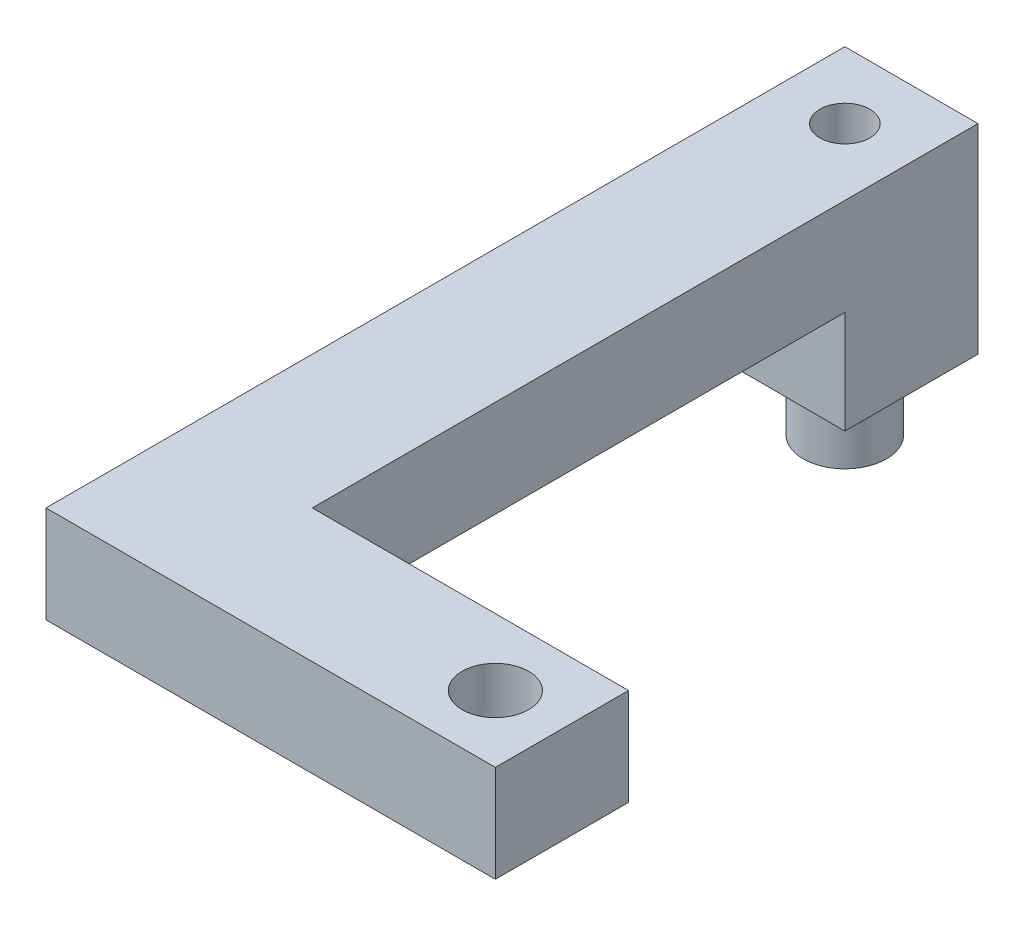
ISO-10303-21;
HEADER;
FILE_DESCRIPTION(('STEP AP214'),'2;1');
FILE_NAME('part.step','',(''),(''),'','','');
FILE_SCHEMA(('AUTOMOTIVE_DESIGN { 1 0 10303 214 1 1 1 1 }'));
ENDSEC;
DATA;
#1=APPLICATION_CONTEXT('core data for automotive mechanical design processes');
#2=APPLICATION_PROTOCOL_DEFINITION('international standard','automotive_design',2000,#1);
#3=PRODUCT_CONTEXT('',#1,'mechanical');
#4=PRODUCT('Part','Part','',(#3));
#5=PRODUCT_RELATED_PRODUCT_CATEGORY('part','',(#4));
#6=PRODUCT_DEFINITION_FORMATION('','',#4);
#7=PRODUCT_DEFINITION_CONTEXT('part definition',#1,'design');
#8=PRODUCT_DEFINITION('design','',#6,#7);
#9=PRODUCT_DEFINITION_SHAPE('','',#8);
#10=(LENGTH_UNIT() NAMED_UNIT(*) SI_UNIT(.MILLI.,.METRE.));
#11=(NAMED_UNIT(*) PLANE_ANGLE_UNIT() SI_UNIT($,.RADIAN.));
#12=(NAMED_UNIT(*) SI_UNIT($,.STERADIAN.) SOLID_ANGLE_UNIT());
#13=UNCERTAINTY_MEASURE_WITH_UNIT(LENGTH_MEASURE(1.E-05),#10,'distance_accuracy_value','');
#14=(GEOMETRIC_REPRESENTATION_CONTEXT(3) GLOBAL_UNCERTAINTY_ASSIGNED_CONTEXT((#13)) GLOBAL_UNIT_ASSIGNED_CONTEXT((#10,
#11,#12)) REPRESENTATION_CONTEXT('',''));
#15=CARTESIAN_POINT('',(0.,0.,0.));
#16=DIRECTION('',(0.,0.,1.));
#17=DIRECTION('',(1.,0.,0.));
#18=AXIS2_PLACEMENT_3D('',#15,#16,#17);
#19=CARTESIAN_POINT('',(-6.17970660146699,12.,-4.71271393643032));
#20=DIRECTION('',(1.,0.,0.));
#21=DIRECTION('',(0.,0.,-1.));
#22=AXIS2_PLACEMENT_3D('',#19,#20,#21);
#23=PLANE('',#22);
#24=DIRECTION('',(0.,0.,-1.));
#25=VECTOR('',#24,1.);
#26=CARTESIAN_POINT('',(-6.17970660146699,6.175,43.2872860635697));
#27=LINE('',#26,#25);
#28=CARTESIAN_POINT('',(-6.17970660146699,6.175,43.2872860635697));
#29=VERTEX_POINT('',#28);
#30=CARTESIAN_POINT('',(-6.179706601467,6.175,3.28728606356969));
#31=VERTEX_POINT('',#30);
#32=EDGE_CURVE('E159',#29,#31,#27,.T.);
#33=ORIENTED_EDGE('',*,*,#32,.F.);
#34=DIRECTION('',(0.,-1.,0.));
#35=VECTOR('',#34,1.);
#36=CARTESIAN_POINT('',(-6.17970660146699,12.,43.2872860635697));
#37=LINE('',#36,#35);
#38=CARTESIAN_POINT('',(-6.17970660146699,12.,43.2872860635697));
#39=VERTEX_POINT('',#38);
#40=EDGE_CURVE('E138',#39,#29,#37,.T.);
#41=ORIENTED_EDGE('',*,*,#40,.F.);
#42=DIRECTION('',(0.,0.,1.));
#43=VECTOR('',#42,1.);
#44=CARTESIAN_POINT('',(-6.17970660146699,12.,-4.71271393643032));
#45=LINE('',#44,#43);
#46=CARTESIAN_POINT('',(-6.17970660146699,12.,-4.71271393643032));
#47=VERTEX_POINT('',#46);
#48=EDGE_CURVE('E122',#47,#39,#45,.T.);
#49=ORIENTED_EDGE('',*,*,#48,.F.);
#50=DIRECTION('',(0.,-1.,0.));
#51=VECTOR('',#50,1.);
#52=CARTESIAN_POINT('',(-6.17970660146699,12.,-4.71271393643032));
#53=LINE('',#52,#51);
#54=CARTESIAN_POINT('',(-6.17970660146699,0.,-4.71271393643032));
#55=VERTEX_POINT('',#54);
#56=EDGE_CURVE('E128',#47,#55,#53,.T.);
#57=ORIENTED_EDGE('',*,*,#56,.T.);
#58=DIRECTION('',(0.,0.,1.));
#59=VECTOR('',#58,1.);
#60=CARTESIAN_POINT('',(-6.17970660146699,0.,-4.71271393643032));
#61=LINE('',#60,#59);
#62=CARTESIAN_POINT('',(-6.179706601467,0.,3.28728606356969));
#63=VERTEX_POINT('',#62);
#64=EDGE_CURVE('E129',#55,#63,#61,.T.);
#65=ORIENTED_EDGE('',*,*,#64,.T.);
#66=DIRECTION('',(0.,-1.,0.));
#67=VECTOR('',#66,1.);
#68=CARTESIAN_POINT('',(-6.179706601467,6.175,3.28728606356969));
#69=LINE('',#68,#67);
#70=EDGE_CURVE('E202',#31,#63,#69,.T.);
#71=ORIENTED_EDGE('',*,*,#70,.F.);
#72=EDGE_LOOP('',(#33,#41,#49,#57,#65,#71));
#73=FACE_BOUND('',#72,.T.);
#74=ADVANCED_FACE('F37',(#73),#23,.F.);
#75=CARTESIAN_POINT('',(-6.17970660146699,12.,43.2872860635697));
#76=DIRECTION('',(0.,0.,-1.));
#77=DIRECTION('',(-1.,0.,0.));
#78=AXIS2_PLACEMENT_3D('',#75,#76,#77);
#79=PLANE('',#78);
#80=DIRECTION('',(1.,0.,0.));
#81=VECTOR('',#80,1.);
#82=CARTESIAN_POINT('',(-6.17970660146699,6.175,43.2872860635697));
#83=LINE('',#82,#81);
#84=CARTESIAN_POINT('',(20.820293398533,6.175,43.2872860635697));
#85=VERTEX_POINT('',#84);
#86=EDGE_CURVE('E144',#29,#85,#83,.T.);
#87=ORIENTED_EDGE('',*,*,#86,.T.);
#88=DIRECTION('',(0.,-1.,0.));
#89=VECTOR('',#88,1.);
#90=CARTESIAN_POINT('',(20.820293398533,12.,43.2872860635697));
#91=LINE('',#90,#89);
#92=CARTESIAN_POINT('',(20.820293398533,12.,43.2872860635697));
#93=VERTEX_POINT('',#92);
#94=EDGE_CURVE('E135',#93,#85,#91,.T.);
#95=ORIENTED_EDGE('',*,*,#94,.F.);
#96=DIRECTION('',(1.,0.,0.));
#97=VECTOR('',#96,1.);
#98=CARTESIAN_POINT('',(-6.17970660146699,12.,43.2872860635697));
#99=LINE('',#98,#97);
#100=EDGE_CURVE('E124',#39,#93,#99,.T.);
#101=ORIENTED_EDGE('',*,*,#100,.F.);
#102=ORIENTED_EDGE('',*,*,#40,.T.);
#103=EDGE_LOOP('',(#87,#95,#101,#102));
#104=FACE_BOUND('',#103,.T.);
#105=ADVANCED_FACE('F192',(#104),#79,.F.);
#106=CARTESIAN_POINT('',(20.820293398533,12.,-4.71271393643032));
#107=DIRECTION('',(-1.,0.,0.));
#108=DIRECTION('',(0.,0.,1.));
#109=AXIS2_PLACEMENT_3D('',#106,#107,#108);
#110=PLANE('',#109);
#111=DIRECTION('',(0.,0.,-1.));
#112=VECTOR('',#111,1.);
#113=CARTESIAN_POINT('',(20.820293398533,6.175,43.2872860635697));
#114=LINE('',#113,#112);
#115=CARTESIAN_POINT('',(20.820293398533,6.175,35.2872860635697));
#116=VERTEX_POINT('',#115);
#117=EDGE_CURVE('E218',#85,#116,#114,.T.);
#118=ORIENTED_EDGE('',*,*,#117,.T.);
#119=DIRECTION('',(0.,1.,0.));
#120=VECTOR('',#119,1.);
#121=CARTESIAN_POINT('',(20.820293398533,0.,35.2872860635697));
#122=LINE('',#121,#120);
#123=CARTESIAN_POINT('',(20.820293398533,12.,35.2872860635697));
#124=VERTEX_POINT('',#123);
#125=EDGE_CURVE('E106',#116,#124,#122,.T.);
#126=ORIENTED_EDGE('',*,*,#125,.T.);
#127=DIRECTION('',(0.,0.,-1.));
#128=VECTOR('',#127,1.);
#129=CARTESIAN_POINT('',(20.820293398533,12.,-4.71271393643032));
#130=LINE('',#129,#128);
#131=EDGE_CURVE('E114',#93,#124,#130,.T.);
#132=ORIENTED_EDGE('',*,*,#131,.F.);
#133=ORIENTED_EDGE('',*,*,#94,.T.);
#134=EDGE_LOOP('',(#118,#126,#132,#133));
#135=FACE_BOUND('',#134,.T.);
#136=ADVANCED_FACE('F197',(#135),#110,.F.);
#137=CARTESIAN_POINT('',(0.,0.,0.));
#138=DIRECTION('',(0.,1.,0.));
#139=DIRECTION('',(0.,0.,1.));
#140=AXIS2_PLACEMENT_3D('',#137,#138,#139);
#141=PLANE('',#140);
#142=CARTESIAN_POINT('',(-2.17970660146699,0.,-0.712713936430315));
#143=DIRECTION('',(0.,1.,0.));
#144=DIRECTION('',(0.,0.,1.));
#145=AXIS2_PLACEMENT_3D('',#142,#143,#144);
#146=CIRCLE('',#145,2.5);
#147=CARTESIAN_POINT('',(-2.17970660146699,0.,1.78728606356968));
#148=VERTEX_POINT('',#147);
#149=EDGE_CURVE('E12',#148,#148,#146,.F.);
#150=ORIENTED_EDGE('',*,*,#149,.F.);
#151=EDGE_LOOP('',(#150));
#152=FACE_BOUND('',#151,.T.);
#153=DIRECTION('',(1.,0.,0.));
#154=VECTOR('',#153,1.);
#155=CARTESIAN_POINT('',(-6.179706601467,0.,3.28728606356969));
#156=LINE('',#155,#154);
#157=CARTESIAN_POINT('',(1.82029339853301,0.,3.28728606356968));
#158=VERTEX_POINT('',#157);
#159=EDGE_CURVE('E51',#63,#158,#156,.T.);
#160=ORIENTED_EDGE('',*,*,#159,.F.);
#161=ORIENTED_EDGE('',*,*,#64,.F.);
#162=DIRECTION('',(-1.,0.,0.));
#163=VECTOR('',#162,1.);
#164=CARTESIAN_POINT('',(-6.17970660146699,0.,-4.71271393643032));
#165=LINE('',#164,#163);
#166=CARTESIAN_POINT('',(1.82029339853301,0.,-4.71271393643031));
#167=VERTEX_POINT('',#166);
#168=EDGE_CURVE('E72',#167,#55,#165,.T.);
#169=ORIENTED_EDGE('',*,*,#168,.F.);
#170=DIRECTION('',(0.,0.,1.));
#171=VECTOR('',#170,1.);
#172=CARTESIAN_POINT('',(1.82029339853301,0.,-4.71271393643031));
#173=LINE('',#172,#171);
#174=EDGE_CURVE('E81',#167,#158,#173,.T.);
#175=ORIENTED_EDGE('',*,*,#174,.T.);
#176=EDGE_LOOP('',(#160,#161,#169,#175));
#177=FACE_BOUND('',#176,.T.);
#178=ADVANCED_FACE('F211',(#152,#177),#141,.F.);
#179=CARTESIAN_POINT('',(20.820293398533,0.,35.2872860635697));
#180=DIRECTION('',(0.,0.,1.));
#181=DIRECTION('',(1.,0.,0.));
#182=AXIS2_PLACEMENT_3D('',#179,#180,#181);
#183=PLANE('',#182);
#184=DIRECTION('',(1.,0.,0.));
#185=VECTOR('',#184,1.);
#186=CARTESIAN_POINT('',(20.820293398533,6.175,35.2872860635697));
#187=LINE('',#186,#185);
#188=CARTESIAN_POINT('',(1.82029339853301,6.175,35.2872860635697));
#189=VERTEX_POINT('',#188);
#190=EDGE_CURVE('E104',#189,#116,#187,.T.);
#191=ORIENTED_EDGE('',*,*,#190,.F.);
#192=DIRECTION('',(0.,1.,0.));
#193=VECTOR('',#192,1.);
#194=CARTESIAN_POINT('',(1.82029339853301,0.,35.2872860635697));
#195=LINE('',#194,#193);
#196=CARTESIAN_POINT('',(1.82029339853301,12.,35.2872860635697));
#197=VERTEX_POINT('',#196);
#198=EDGE_CURVE('E96',#189,#197,#195,.T.);
#199=ORIENTED_EDGE('',*,*,#198,.T.);
#200=DIRECTION('',(1.,0.,0.));
#201=VECTOR('',#200,1.);
#202=CARTESIAN_POINT('',(20.820293398533,12.,35.2872860635697));
#203=LINE('',#202,#201);
#204=EDGE_CURVE('E101',#197,#124,#203,.T.);
#205=ORIENTED_EDGE('',*,*,#204,.T.);
#206=ORIENTED_EDGE('',*,*,#125,.F.);
#207=EDGE_LOOP('',(#191,#199,#205,#206));
#208=FACE_BOUND('',#207,.T.);
#209=ADVANCED_FACE('F98',(#208),#183,.F.);
#210=CARTESIAN_POINT('',(1.82029339853301,0.,-4.71271393643031));
#211=DIRECTION('',(-1.,0.,0.));
#212=DIRECTION('',(0.,0.,1.));
#213=AXIS2_PLACEMENT_3D('',#210,#211,#212);
#214=PLANE('',#213);
#215=DIRECTION('',(0.,0.,1.));
#216=VECTOR('',#215,1.);
#217=CARTESIAN_POINT('',(1.82029339853301,6.175,-4.71271393643031));
#218=LINE('',#217,#216);
#219=CARTESIAN_POINT('',(1.82029339853301,6.175,3.28728606356968));
#220=VERTEX_POINT('',#219);
#221=EDGE_CURVE('E143',#220,#189,#218,.T.);
#222=ORIENTED_EDGE('',*,*,#221,.F.);
#223=DIRECTION('',(0.,1.,0.));
#224=VECTOR('',#223,1.);
#225=CARTESIAN_POINT('',(1.82029339853301,0.,3.28728606356968));
#226=LINE('',#225,#224);
#227=EDGE_CURVE('E44',#158,#220,#226,.T.);
#228=ORIENTED_EDGE('',*,*,#227,.F.);
#229=ORIENTED_EDGE('',*,*,#174,.F.);
#230=DIRECTION('',(0.,1.,0.));
#231=VECTOR('',#230,1.);
#232=CARTESIAN_POINT('',(1.82029339853301,0.,-4.71271393643031));
#233=LINE('',#232,#231);
#234=CARTESIAN_POINT('',(1.82029339853301,12.,-4.71271393643031));
#235=VERTEX_POINT('',#234);
#236=EDGE_CURVE('E107',#167,#235,#233,.T.);
#237=ORIENTED_EDGE('',*,*,#236,.T.);
#238=DIRECTION('',(0.,0.,1.));
#239=VECTOR('',#238,1.);
#240=CARTESIAN_POINT('',(1.82029339853301,12.,-4.71271393643031));
#241=LINE('',#240,#239);
#242=EDGE_CURVE('E109',#235,#197,#241,.T.);
#243=ORIENTED_EDGE('',*,*,#242,.T.);
#244=ORIENTED_EDGE('',*,*,#198,.F.);
#245=EDGE_LOOP('',(#222,#228,#229,#237,#243,#244));
#246=FACE_BOUND('',#245,.T.);
#247=ADVANCED_FACE('F110',(#246),#214,.F.);
#248=CARTESIAN_POINT('',(16.820293398533,0.,39.2872860635697));
#249=DIRECTION('',(0.,1.,0.));
#250=DIRECTION('',(0.,0.,1.));
#251=AXIS2_PLACEMENT_3D('',#248,#249,#250);
#252=CYLINDRICAL_SURFACE('',#251,2.);
#253=CARTESIAN_POINT('',(16.820293398533,12.,39.2872860635697));
#254=DIRECTION('',(0.,1.,0.));
#255=DIRECTION('',(0.,0.,1.));
#256=AXIS2_PLACEMENT_3D('',#253,#254,#255);
#257=CIRCLE('',#256,2.);
#258=CARTESIAN_POINT('',(16.820293398533,12.,41.2872860635697));
#259=VERTEX_POINT('',#258);
#260=EDGE_CURVE('E119',#259,#259,#257,.T.);
#261=ORIENTED_EDGE('',*,*,#260,.T.);
#262=EDGE_LOOP('',(#261));
#263=FACE_BOUND('',#262,.T.);
#264=CARTESIAN_POINT('',(16.820293398533,6.175,39.2872860635697));
#265=DIRECTION('',(0.,-1.,0.));
#266=DIRECTION('',(0.,0.,-1.));
#267=AXIS2_PLACEMENT_3D('',#264,#265,#266);
#268=CIRCLE('',#267,2.);
#269=CARTESIAN_POINT('',(16.820293398533,6.175,37.2872860635697));
#270=VERTEX_POINT('',#269);
#271=EDGE_CURVE('E141',#270,#270,#268,.F.);
#272=ORIENTED_EDGE('',*,*,#271,.F.);
#273=EDGE_LOOP('',(#272));
#274=FACE_BOUND('',#273,.T.);
#275=ADVANCED_FACE('F173',(#263,#274),#252,.F.);
#276=CARTESIAN_POINT('',(-6.17970660146699,12.,-4.71271393643032));
#277=DIRECTION('',(0.,0.,1.));
#278=DIRECTION('',(1.,0.,0.));
#279=AXIS2_PLACEMENT_3D('',#276,#277,#278);
#280=PLANE('',#279);
#281=DIRECTION('',(-1.,0.,0.));
#282=VECTOR('',#281,1.);
#283=CARTESIAN_POINT('',(-6.17970660146699,12.,-4.71271393643032));
#284=LINE('',#283,#282);
#285=EDGE_CURVE('E60',#235,#47,#284,.T.);
#286=ORIENTED_EDGE('',*,*,#285,.F.);
#287=ORIENTED_EDGE('',*,*,#236,.F.);
#288=ORIENTED_EDGE('',*,*,#168,.T.);
#289=ORIENTED_EDGE('',*,*,#56,.F.);
#290=EDGE_LOOP('',(#286,#287,#288,#289));
#291=FACE_BOUND('',#290,.T.);
#292=ADVANCED_FACE('F178',(#291),#280,.F.);
#293=CARTESIAN_POINT('',(0.,12.,0.));
#294=DIRECTION('',(0.,1.,0.));
#295=DIRECTION('',(0.,0.,1.));
#296=AXIS2_PLACEMENT_3D('',#293,#294,#295);
#297=PLANE('',#296);
#298=CARTESIAN_POINT('',(-2.17970660146699,12.,-0.712713936430315));
#299=DIRECTION('',(0.,1.,0.));
#300=DIRECTION('',(0.,0.,1.));
#301=AXIS2_PLACEMENT_3D('',#298,#299,#300);
#302=CIRCLE('',#301,1.5);
#303=CARTESIAN_POINT('',(-2.17970660146699,12.,0.787286063569685));
#304=VERTEX_POINT('',#303);
#305=EDGE_CURVE('E167',#304,#304,#302,.T.);
#306=ORIENTED_EDGE('',*,*,#305,.F.);
#307=EDGE_LOOP('',(#306));
#308=FACE_BOUND('',#307,.T.);
#309=ORIENTED_EDGE('',*,*,#260,.F.);
#310=EDGE_LOOP('',(#309));
#311=FACE_BOUND('',#310,.T.);
#312=ORIENTED_EDGE('',*,*,#204,.F.);
#313=ORIENTED_EDGE('',*,*,#242,.F.);
#314=ORIENTED_EDGE('',*,*,#285,.T.);
#315=ORIENTED_EDGE('',*,*,#48,.T.);
#316=ORIENTED_EDGE('',*,*,#100,.T.);
#317=ORIENTED_EDGE('',*,*,#131,.T.);
#318=EDGE_LOOP('',(#312,#313,#314,#315,#316,#317));
#319=FACE_BOUND('',#318,.T.);
#320=ADVANCED_FACE('F112',(#308,#311,#319),#297,.T.);
#321=CARTESIAN_POINT('',(-2.17970660146699,0.,-0.712713936430315));
#322=DIRECTION('',(0.,1.,0.));
#323=DIRECTION('',(0.,0.,1.));
#324=AXIS2_PLACEMENT_3D('',#321,#322,#323);
#325=CYLINDRICAL_SURFACE('',#324,1.5);
#326=CARTESIAN_POINT('',(-2.17970660146699,0.,-0.712713936430315));
#327=DIRECTION('',(0.,1.,0.));
#328=DIRECTION('',(0.,0.,1.));
#329=AXIS2_PLACEMENT_3D('',#326,#327,#328);
#330=CIRCLE('',#329,1.5);
#331=CARTESIAN_POINT('',(-2.17970660146699,0.,0.787286063569685));
#332=VERTEX_POINT('',#331);
#333=EDGE_CURVE('E132',#332,#332,#330,.T.);
#334=ORIENTED_EDGE('',*,*,#333,.F.);
#335=EDGE_LOOP('',(#334));
#336=FACE_BOUND('',#335,.T.);
#337=ORIENTED_EDGE('',*,*,#305,.T.);
#338=EDGE_LOOP('',(#337));
#339=FACE_BOUND('',#338,.T.);
#340=ADVANCED_FACE('F177',(#336,#339),#325,.F.);
#341=CARTESIAN_POINT('',(-6.179706601467,6.175,3.28728606356969));
#342=DIRECTION('',(0.,0.,1.));
#343=DIRECTION('',(1.,0.,0.));
#344=AXIS2_PLACEMENT_3D('',#341,#342,#343);
#345=PLANE('',#344);
#346=ORIENTED_EDGE('',*,*,#227,.T.);
#347=DIRECTION('',(1.,0.,0.));
#348=VECTOR('',#347,1.);
#349=CARTESIAN_POINT('',(-6.179706601467,6.175,3.28728606356969));
#350=LINE('',#349,#348);
#351=EDGE_CURVE('E150',#31,#220,#350,.T.);
#352=ORIENTED_EDGE('',*,*,#351,.F.);
#353=ORIENTED_EDGE('',*,*,#70,.T.);
#354=ORIENTED_EDGE('',*,*,#159,.T.);
#355=EDGE_LOOP('',(#346,#352,#353,#354));
#356=FACE_BOUND('',#355,.T.);
#357=ADVANCED_FACE('F148',(#356),#345,.T.);
#358=CARTESIAN_POINT('',(-6.17970660146699,6.175,43.2872860635697));
#359=DIRECTION('',(0.,-1.,0.));
#360=DIRECTION('',(0.,0.,-1.));
#361=AXIS2_PLACEMENT_3D('',#358,#359,#360);
#362=PLANE('',#361);
#363=ORIENTED_EDGE('',*,*,#271,.T.);
#364=EDGE_LOOP('',(#363));
#365=FACE_BOUND('',#364,.T.);
#366=ORIENTED_EDGE('',*,*,#190,.T.);
#367=ORIENTED_EDGE('',*,*,#117,.F.);
#368=ORIENTED_EDGE('',*,*,#86,.F.);
#369=ORIENTED_EDGE('',*,*,#32,.T.);
#370=ORIENTED_EDGE('',*,*,#351,.T.);
#371=ORIENTED_EDGE('',*,*,#221,.T.);
#372=EDGE_LOOP('',(#366,#367,#368,#369,#370,#371));
#373=FACE_BOUND('',#372,.T.);
#374=ADVANCED_FACE('F156',(#365,#373),#362,.T.);
#375=CARTESIAN_POINT('',(-2.17970660146699,0.,-0.712713936430315));
#376=DIRECTION('',(0.,-1.,0.));
#377=DIRECTION('',(0.,0.,-1.));
#378=AXIS2_PLACEMENT_3D('',#375,#376,#377);
#379=PLANE('',#378);
#380=ORIENTED_EDGE('',*,*,#333,.T.);
#381=EDGE_LOOP('',(#380));
#382=FACE_BOUND('',#381,.T.);
#383=ADVANCED_FACE('F233',(#382),#379,.F.);
#384=CARTESIAN_POINT('',(-2.17970660146699,-4.2,-0.712713936430315));
#385=DIRECTION('',(0.,1.,0.));
#386=DIRECTION('',(0.,0.,1.));
#387=AXIS2_PLACEMENT_3D('',#384,#385,#386);
#388=CYLINDRICAL_SURFACE('',#387,2.5);
#389=CARTESIAN_POINT('',(-2.17970660146699,-4.2,-0.712713936430315));
#390=DIRECTION('',(0.,-1.,0.));
#391=DIRECTION('',(0.,0.,-1.));
#392=AXIS2_PLACEMENT_3D('',#389,#390,#391);
#393=CIRCLE('',#392,2.5);
#394=CARTESIAN_POINT('',(-2.17970660146699,-4.2,-3.21271393643032));
#395=VERTEX_POINT('',#394);
#396=EDGE_CURVE('E220',#395,#395,#393,.T.);
#397=ORIENTED_EDGE('',*,*,#396,.F.);
#398=EDGE_LOOP('',(#397));
#399=FACE_BOUND('',#398,.T.);
#400=ORIENTED_EDGE('',*,*,#149,.T.);
#401=EDGE_LOOP('',(#400));
#402=FACE_BOUND('',#401,.T.);
#403=ADVANCED_FACE('F230',(#399,#402),#388,.T.);
#404=CARTESIAN_POINT('',(-2.17970660146699,-4.2,-0.712713936430315));
#405=DIRECTION('',(0.,-1.,0.));
#406=DIRECTION('',(0.,0.,-1.));
#407=AXIS2_PLACEMENT_3D('',#404,#405,#406);
#408=PLANE('',#407);
#409=ORIENTED_EDGE('',*,*,#396,.T.);
#410=EDGE_LOOP('',(#409));
#411=FACE_BOUND('',#410,.T.);
#412=ADVANCED_FACE('F228',(#411),#408,.T.);
#413=CLOSED_SHELL('',(#74,#105,#136,#178,#209,#247,#275,#292,#320,#340,#357,#374,#383,#403,#412));
#414=MANIFOLD_SOLID_BREP('B2',#413);
#415=ADVANCED_BREP_SHAPE_REPRESENTATION('',(#18,#414),#14);
#416=SHAPE_DEFINITION_REPRESENTATION(#9,#415);
ENDSEC;
END-ISO-10303-21;
